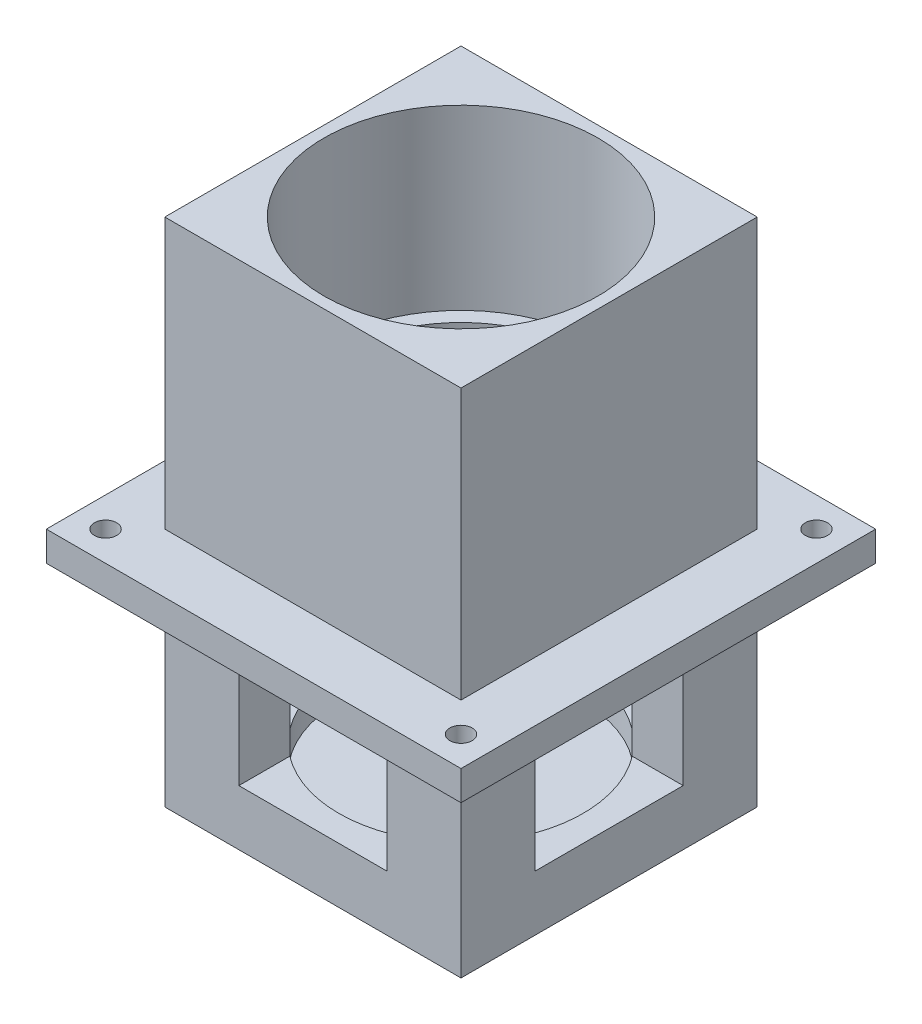
ISO-10303-21;
HEADER;
FILE_DESCRIPTION(('STEP AP214'),'2;1');
FILE_NAME('part.step','',(''),(''),'','','');
FILE_SCHEMA(('AUTOMOTIVE_DESIGN { 1 0 10303 214 1 1 1 1 }'));
ENDSEC;
DATA;
#1=APPLICATION_CONTEXT('core data for automotive mechanical design processes');
#2=APPLICATION_PROTOCOL_DEFINITION('international standard','automotive_design',2000,#1);
#3=PRODUCT_CONTEXT('',#1,'mechanical');
#4=PRODUCT('Part','Part','',(#3));
#5=PRODUCT_RELATED_PRODUCT_CATEGORY('part','',(#4));
#6=PRODUCT_DEFINITION_FORMATION('','',#4);
#7=PRODUCT_DEFINITION_CONTEXT('part definition',#1,'design');
#8=PRODUCT_DEFINITION('design','',#6,#7);
#9=PRODUCT_DEFINITION_SHAPE('','',#8);
#10=(LENGTH_UNIT() NAMED_UNIT(*) SI_UNIT(.MILLI.,.METRE.));
#11=(NAMED_UNIT(*) PLANE_ANGLE_UNIT() SI_UNIT($,.RADIAN.));
#12=(NAMED_UNIT(*) SI_UNIT($,.STERADIAN.) SOLID_ANGLE_UNIT());
#13=UNCERTAINTY_MEASURE_WITH_UNIT(LENGTH_MEASURE(1.E-05),#10,'distance_accuracy_value','');
#14=(GEOMETRIC_REPRESENTATION_CONTEXT(3) GLOBAL_UNCERTAINTY_ASSIGNED_CONTEXT((#13)) GLOBAL_UNIT_ASSIGNED_CONTEXT((#10,
#11,#12)) REPRESENTATION_CONTEXT('',''));
#15=CARTESIAN_POINT('',(0.,0.,0.));
#16=DIRECTION('',(0.,0.,1.));
#17=DIRECTION('',(1.,0.,0.));
#18=AXIS2_PLACEMENT_3D('',#15,#16,#17);
#19=CARTESIAN_POINT('',(-20.,90.,20.));
#20=DIRECTION('',(1.,0.,0.));
#21=DIRECTION('',(0.,0.,-1.));
#22=AXIS2_PLACEMENT_3D('',#19,#20,#21);
#23=PLANE('',#22);
#24=DIRECTION('',(0.,0.,1.));
#25=VECTOR('',#24,1.);
#26=CARTESIAN_POINT('',(-20.,22.5,-10.));
#27=LINE('',#26,#25);
#28=CARTESIAN_POINT('',(-20.,22.5,-10.));
#29=VERTEX_POINT('',#28);
#30=CARTESIAN_POINT('',(-20.,22.5,10.));
#31=VERTEX_POINT('',#30);
#32=EDGE_CURVE('E239',#29,#31,#27,.T.);
#33=ORIENTED_EDGE('',*,*,#32,.T.);
#34=DIRECTION('',(0.,1.,0.));
#35=VECTOR('',#34,1.);
#36=CARTESIAN_POINT('',(-20.,7.5,10.));
#37=LINE('',#36,#35);
#38=CARTESIAN_POINT('',(-20.,7.5,10.));
#39=VERTEX_POINT('',#38);
#40=EDGE_CURVE('E330',#39,#31,#37,.T.);
#41=ORIENTED_EDGE('',*,*,#40,.F.);
#42=DIRECTION('',(0.,0.,1.));
#43=VECTOR('',#42,1.);
#44=CARTESIAN_POINT('',(-20.,7.5,-10.));
#45=LINE('',#44,#43);
#46=CARTESIAN_POINT('',(-20.,7.5,-10.));
#47=VERTEX_POINT('',#46);
#48=EDGE_CURVE('E334',#47,#39,#45,.T.);
#49=ORIENTED_EDGE('',*,*,#48,.F.);
#50=DIRECTION('',(0.,1.,0.));
#51=VECTOR('',#50,1.);
#52=CARTESIAN_POINT('',(-20.,7.5,-10.));
#53=LINE('',#52,#51);
#54=EDGE_CURVE('E315',#47,#29,#53,.T.);
#55=ORIENTED_EDGE('',*,*,#54,.T.);
#56=EDGE_LOOP('',(#33,#41,#49,#55));
#57=FACE_BOUND('',#56,.T.);
#58=DIRECTION('',(0.,0.,1.));
#59=VECTOR('',#58,1.);
#60=CARTESIAN_POINT('',(-20.,28.5,-28.));
#61=LINE('',#60,#59);
#62=CARTESIAN_POINT('',(-20.,28.5,-20.));
#63=VERTEX_POINT('',#62);
#64=CARTESIAN_POINT('',(-20.,28.5,20.));
#65=VERTEX_POINT('',#64);
#66=EDGE_CURVE('E53',#63,#65,#61,.T.);
#67=ORIENTED_EDGE('',*,*,#66,.F.);
#68=DIRECTION('',(0.,-1.,0.));
#69=VECTOR('',#68,1.);
#70=CARTESIAN_POINT('',(-20.,90.,-20.));
#71=LINE('',#70,#69);
#72=CARTESIAN_POINT('',(-20.,0.,-20.));
#73=VERTEX_POINT('',#72);
#74=EDGE_CURVE('E506',#63,#73,#71,.T.);
#75=ORIENTED_EDGE('',*,*,#74,.T.);
#76=DIRECTION('',(0.,0.,1.));
#77=VECTOR('',#76,1.);
#78=CARTESIAN_POINT('',(-20.,0.,20.));
#79=LINE('',#78,#77);
#80=CARTESIAN_POINT('',(-20.,0.,20.));
#81=VERTEX_POINT('',#80);
#82=EDGE_CURVE('E488',#73,#81,#79,.T.);
#83=ORIENTED_EDGE('',*,*,#82,.T.);
#84=DIRECTION('',(0.,-1.,0.));
#85=VECTOR('',#84,1.);
#86=CARTESIAN_POINT('',(-20.,90.,20.));
#87=LINE('',#86,#85);
#88=EDGE_CURVE('E501',#65,#81,#87,.T.);
#89=ORIENTED_EDGE('',*,*,#88,.F.);
#90=EDGE_LOOP('',(#67,#75,#83,#89));
#91=FACE_BOUND('',#90,.T.);
#92=ADVANCED_FACE('F43',(#57,#91),#23,.F.);
#93=CARTESIAN_POINT('',(20.,90.,20.));
#94=DIRECTION('',(-1.,0.,0.));
#95=DIRECTION('',(0.,0.,1.));
#96=AXIS2_PLACEMENT_3D('',#93,#94,#95);
#97=PLANE('',#96);
#98=DIRECTION('',(0.,0.,1.));
#99=VECTOR('',#98,1.);
#100=CARTESIAN_POINT('',(20.,32.5,28.));
#101=LINE('',#100,#99);
#102=CARTESIAN_POINT('',(20.,32.5,-20.));
#103=VERTEX_POINT('',#102);
#104=CARTESIAN_POINT('',(20.,32.5,20.));
#105=VERTEX_POINT('',#104);
#106=EDGE_CURVE('E271',#103,#105,#101,.T.);
#107=ORIENTED_EDGE('',*,*,#106,.F.);
#108=DIRECTION('',(0.,-1.,0.));
#109=VECTOR('',#108,1.);
#110=CARTESIAN_POINT('',(20.,90.,-20.));
#111=LINE('',#110,#109);
#112=CARTESIAN_POINT('',(20.,69.,-20.));
#113=VERTEX_POINT('',#112);
#114=EDGE_CURVE('E288',#113,#103,#111,.T.);
#115=ORIENTED_EDGE('',*,*,#114,.F.);
#116=DIRECTION('',(0.,0.,-1.));
#117=VECTOR('',#116,1.);
#118=CARTESIAN_POINT('',(20.,69.,20.));
#119=LINE('',#118,#117);
#120=CARTESIAN_POINT('',(20.,69.,20.));
#121=VERTEX_POINT('',#120);
#122=EDGE_CURVE('E456',#121,#113,#119,.T.);
#123=ORIENTED_EDGE('',*,*,#122,.F.);
#124=DIRECTION('',(0.,-1.,0.));
#125=VECTOR('',#124,1.);
#126=CARTESIAN_POINT('',(20.,90.,20.));
#127=LINE('',#126,#125);
#128=EDGE_CURVE('E497',#121,#105,#127,.T.);
#129=ORIENTED_EDGE('',*,*,#128,.T.);
#130=EDGE_LOOP('',(#107,#115,#123,#129));
#131=FACE_BOUND('',#130,.T.);
#132=ADVANCED_FACE('F45',(#131),#97,.F.);
#133=DIRECTION('',(0.,0.,1.));
#134=VECTOR('',#133,1.);
#135=CARTESIAN_POINT('',(20.,22.5,-10.));
#136=LINE('',#135,#134);
#137=CARTESIAN_POINT('',(20.,22.5,-10.));
#138=VERTEX_POINT('',#137);
#139=CARTESIAN_POINT('',(20.,22.5,10.));
#140=VERTEX_POINT('',#139);
#141=EDGE_CURVE('E311',#138,#140,#136,.T.);
#142=ORIENTED_EDGE('',*,*,#141,.F.);
#143=DIRECTION('',(0.,1.,0.));
#144=VECTOR('',#143,1.);
#145=CARTESIAN_POINT('',(20.,7.5,-10.));
#146=LINE('',#145,#144);
#147=CARTESIAN_POINT('',(20.,7.50000000000001,-10.));
#148=VERTEX_POINT('',#147);
#149=EDGE_CURVE('E323',#148,#138,#146,.T.);
#150=ORIENTED_EDGE('',*,*,#149,.F.);
#151=DIRECTION('',(0.,0.,1.));
#152=VECTOR('',#151,1.);
#153=CARTESIAN_POINT('',(20.,7.5,-10.));
#154=LINE('',#153,#152);
#155=CARTESIAN_POINT('',(20.,7.5,10.));
#156=VERTEX_POINT('',#155);
#157=EDGE_CURVE('E319',#148,#156,#154,.T.);
#158=ORIENTED_EDGE('',*,*,#157,.T.);
#159=DIRECTION('',(0.,1.,0.));
#160=VECTOR('',#159,1.);
#161=CARTESIAN_POINT('',(20.,7.5,10.));
#162=LINE('',#161,#160);
#163=EDGE_CURVE('E314',#156,#140,#162,.T.);
#164=ORIENTED_EDGE('',*,*,#163,.T.);
#165=EDGE_LOOP('',(#142,#150,#158,#164));
#166=FACE_BOUND('',#165,.T.);
#167=DIRECTION('',(0.,0.,-1.));
#168=VECTOR('',#167,1.);
#169=CARTESIAN_POINT('',(20.,28.5,28.));
#170=LINE('',#169,#168);
#171=CARTESIAN_POINT('',(20.,28.5,20.));
#172=VERTEX_POINT('',#171);
#173=CARTESIAN_POINT('',(20.,28.5,-20.));
#174=VERTEX_POINT('',#173);
#175=EDGE_CURVE('E61',#172,#174,#170,.T.);
#176=ORIENTED_EDGE('',*,*,#175,.F.);
#177=CARTESIAN_POINT('',(20.,0.,20.));
#178=VERTEX_POINT('',#177);
#179=EDGE_CURVE('E496',#172,#178,#127,.T.);
#180=ORIENTED_EDGE('',*,*,#179,.T.);
#181=DIRECTION('',(0.,0.,-1.));
#182=VECTOR('',#181,1.);
#183=CARTESIAN_POINT('',(20.,0.,20.));
#184=LINE('',#183,#182);
#185=CARTESIAN_POINT('',(20.,0.,-20.));
#186=VERTEX_POINT('',#185);
#187=EDGE_CURVE('E480',#178,#186,#184,.T.);
#188=ORIENTED_EDGE('',*,*,#187,.T.);
#189=EDGE_CURVE('E510',#174,#186,#111,.T.);
#190=ORIENTED_EDGE('',*,*,#189,.F.);
#191=EDGE_LOOP('',(#176,#180,#188,#190));
#192=FACE_BOUND('',#191,.T.);
#193=ADVANCED_FACE('F529',(#166,#192),#97,.F.);
#194=CARTESIAN_POINT('',(-20.,90.,-20.));
#195=DIRECTION('',(0.,0.,1.));
#196=DIRECTION('',(1.,0.,0.));
#197=AXIS2_PLACEMENT_3D('',#194,#195,#196);
#198=PLANE('',#197);
#199=DIRECTION('',(1.,0.,0.));
#200=VECTOR('',#199,1.);
#201=CARTESIAN_POINT('',(20.,32.5,-20.));
#202=LINE('',#201,#200);
#203=CARTESIAN_POINT('',(-20.,32.5,-20.));
#204=VERTEX_POINT('',#203);
#205=EDGE_CURVE('E294',#204,#103,#202,.T.);
#206=ORIENTED_EDGE('',*,*,#205,.F.);
#207=CARTESIAN_POINT('',(-20.,69.,-20.));
#208=VERTEX_POINT('',#207);
#209=EDGE_CURVE('E507',#208,#204,#71,.T.);
#210=ORIENTED_EDGE('',*,*,#209,.F.);
#211=DIRECTION('',(-1.,0.,0.));
#212=VECTOR('',#211,1.);
#213=CARTESIAN_POINT('',(-20.,69.,-20.));
#214=LINE('',#213,#212);
#215=EDGE_CURVE('E459',#113,#208,#214,.T.);
#216=ORIENTED_EDGE('',*,*,#215,.F.);
#217=ORIENTED_EDGE('',*,*,#114,.T.);
#218=EDGE_LOOP('',(#206,#210,#216,#217));
#219=FACE_BOUND('',#218,.T.);
#220=ADVANCED_FACE('F615',(#219),#198,.F.);
#221=DIRECTION('',(1.,0.,0.));
#222=VECTOR('',#221,1.);
#223=CARTESIAN_POINT('',(-10.,22.5,-20.));
#224=LINE('',#223,#222);
#225=CARTESIAN_POINT('',(-10.,22.5,-20.));
#226=VERTEX_POINT('',#225);
#227=CARTESIAN_POINT('',(10.,22.5,-20.));
#228=VERTEX_POINT('',#227);
#229=EDGE_CURVE('E383',#226,#228,#224,.T.);
#230=ORIENTED_EDGE('',*,*,#229,.F.);
#231=DIRECTION('',(0.,1.,0.));
#232=VECTOR('',#231,1.);
#233=CARTESIAN_POINT('',(-10.,7.5,-20.));
#234=LINE('',#233,#232);
#235=CARTESIAN_POINT('',(-10.,7.50000000000001,-20.));
#236=VERTEX_POINT('',#235);
#237=EDGE_CURVE('E395',#236,#226,#234,.T.);
#238=ORIENTED_EDGE('',*,*,#237,.F.);
#239=DIRECTION('',(1.,0.,0.));
#240=VECTOR('',#239,1.);
#241=CARTESIAN_POINT('',(-10.,7.5,-20.));
#242=LINE('',#241,#240);
#243=CARTESIAN_POINT('',(10.,7.5,-20.));
#244=VERTEX_POINT('',#243);
#245=EDGE_CURVE('E391',#236,#244,#242,.T.);
#246=ORIENTED_EDGE('',*,*,#245,.T.);
#247=DIRECTION('',(0.,1.,0.));
#248=VECTOR('',#247,1.);
#249=CARTESIAN_POINT('',(10.,7.5,-20.));
#250=LINE('',#249,#248);
#251=EDGE_CURVE('E386',#244,#228,#250,.T.);
#252=ORIENTED_EDGE('',*,*,#251,.T.);
#253=EDGE_LOOP('',(#230,#238,#246,#252));
#254=FACE_BOUND('',#253,.T.);
#255=DIRECTION('',(-1.,0.,0.));
#256=VECTOR('',#255,1.);
#257=CARTESIAN_POINT('',(20.,28.5,-20.));
#258=LINE('',#257,#256);
#259=EDGE_CURVE('E285',#174,#63,#258,.T.);
#260=ORIENTED_EDGE('',*,*,#259,.F.);
#261=ORIENTED_EDGE('',*,*,#189,.T.);
#262=DIRECTION('',(-1.,0.,0.));
#263=VECTOR('',#262,1.);
#264=CARTESIAN_POINT('',(-20.,0.,-20.));
#265=LINE('',#264,#263);
#266=EDGE_CURVE('E484',#186,#73,#265,.T.);
#267=ORIENTED_EDGE('',*,*,#266,.T.);
#268=ORIENTED_EDGE('',*,*,#74,.F.);
#269=EDGE_LOOP('',(#260,#261,#267,#268));
#270=FACE_BOUND('',#269,.T.);
#271=ADVANCED_FACE('F521',(#254,#270),#198,.F.);
#272=CARTESIAN_POINT('',(-20.,90.,20.));
#273=DIRECTION('',(0.,0.,-1.));
#274=DIRECTION('',(-1.,0.,0.));
#275=AXIS2_PLACEMENT_3D('',#272,#273,#274);
#276=PLANE('',#275);
#277=DIRECTION('',(-1.,0.,0.));
#278=VECTOR('',#277,1.);
#279=CARTESIAN_POINT('',(-20.0000000000002,32.5,20.));
#280=LINE('',#279,#278);
#281=CARTESIAN_POINT('',(-20.,32.5,20.));
#282=VERTEX_POINT('',#281);
#283=EDGE_CURVE('E304',#105,#282,#280,.T.);
#284=ORIENTED_EDGE('',*,*,#283,.F.);
#285=ORIENTED_EDGE('',*,*,#128,.F.);
#286=DIRECTION('',(1.,0.,0.));
#287=VECTOR('',#286,1.);
#288=CARTESIAN_POINT('',(-20.,69.,20.));
#289=LINE('',#288,#287);
#290=CARTESIAN_POINT('',(-20.,69.,20.));
#291=VERTEX_POINT('',#290);
#292=EDGE_CURVE('E465',#291,#121,#289,.T.);
#293=ORIENTED_EDGE('',*,*,#292,.F.);
#294=EDGE_CURVE('E502',#291,#282,#87,.T.);
#295=ORIENTED_EDGE('',*,*,#294,.T.);
#296=EDGE_LOOP('',(#284,#285,#293,#295));
#297=FACE_BOUND('',#296,.T.);
#298=ADVANCED_FACE('F620',(#297),#276,.F.);
#299=DIRECTION('',(1.,0.,0.));
#300=VECTOR('',#299,1.);
#301=CARTESIAN_POINT('',(-10.,22.5,20.));
#302=LINE('',#301,#300);
#303=CARTESIAN_POINT('',(-10.,22.5,20.));
#304=VERTEX_POINT('',#303);
#305=CARTESIAN_POINT('',(10.,22.5,20.));
#306=VERTEX_POINT('',#305);
#307=EDGE_CURVE('E399',#304,#306,#302,.T.);
#308=ORIENTED_EDGE('',*,*,#307,.T.);
#309=DIRECTION('',(0.,1.,0.));
#310=VECTOR('',#309,1.);
#311=CARTESIAN_POINT('',(10.,7.5,20.));
#312=LINE('',#311,#310);
#313=CARTESIAN_POINT('',(10.,7.5,20.));
#314=VERTEX_POINT('',#313);
#315=EDGE_CURVE('E403',#314,#306,#312,.T.);
#316=ORIENTED_EDGE('',*,*,#315,.F.);
#317=DIRECTION('',(1.,0.,0.));
#318=VECTOR('',#317,1.);
#319=CARTESIAN_POINT('',(-10.,7.5,20.));
#320=LINE('',#319,#318);
#321=CARTESIAN_POINT('',(-10.,7.5,20.));
#322=VERTEX_POINT('',#321);
#323=EDGE_CURVE('E407',#322,#314,#320,.T.);
#324=ORIENTED_EDGE('',*,*,#323,.F.);
#325=DIRECTION('',(0.,1.,0.));
#326=VECTOR('',#325,1.);
#327=CARTESIAN_POINT('',(-10.,7.5,20.));
#328=LINE('',#327,#326);
#329=EDGE_CURVE('E387',#322,#304,#328,.T.);
#330=ORIENTED_EDGE('',*,*,#329,.T.);
#331=EDGE_LOOP('',(#308,#316,#324,#330));
#332=FACE_BOUND('',#331,.T.);
#333=DIRECTION('',(1.,0.,0.));
#334=VECTOR('',#333,1.);
#335=CARTESIAN_POINT('',(-20.0000000000002,28.5,20.));
#336=LINE('',#335,#334);
#337=EDGE_CURVE('E297',#65,#172,#336,.T.);
#338=ORIENTED_EDGE('',*,*,#337,.F.);
#339=ORIENTED_EDGE('',*,*,#88,.T.);
#340=DIRECTION('',(1.,0.,0.));
#341=VECTOR('',#340,1.);
#342=CARTESIAN_POINT('',(-20.,0.,20.));
#343=LINE('',#342,#341);
#344=EDGE_CURVE('E492',#81,#178,#343,.T.);
#345=ORIENTED_EDGE('',*,*,#344,.T.);
#346=ORIENTED_EDGE('',*,*,#179,.F.);
#347=EDGE_LOOP('',(#338,#339,#345,#346));
#348=FACE_BOUND('',#347,.T.);
#349=ADVANCED_FACE('F533',(#332,#348),#276,.F.);
#350=CARTESIAN_POINT('',(0.,4.,0.));
#351=DIRECTION('',(0.,1.,0.));
#352=DIRECTION('',(0.,0.,1.));
#353=AXIS2_PLACEMENT_3D('',#350,#351,#352);
#354=CYLINDRICAL_SURFACE('',#353,16.5);
#355=CARTESIAN_POINT('',(0.,22.5,0.));
#356=DIRECTION('',(0.,-1.,0.));
#357=DIRECTION('',(0.,0.,-1.));
#358=AXIS2_PLACEMENT_3D('',#355,#356,#357);
#359=CIRCLE('',#358,16.5);
#360=CARTESIAN_POINT('',(-13.1244047484067,22.5,-10.));
#361=VERTEX_POINT('',#360);
#362=CARTESIAN_POINT('',(-13.1244047484067,22.5,10.));
#363=VERTEX_POINT('',#362);
#364=EDGE_CURVE('E382',#361,#363,#359,.F.);
#365=ORIENTED_EDGE('',*,*,#364,.F.);
#366=DIRECTION('',(0.,1.,0.));
#367=VECTOR('',#366,1.);
#368=CARTESIAN_POINT('',(-13.1244047484067,4.,-10.));
#369=LINE('',#368,#367);
#370=CARTESIAN_POINT('',(-13.1244047484067,7.5,-10.));
#371=VERTEX_POINT('',#370);
#372=EDGE_CURVE('E359',#371,#361,#369,.T.);
#373=ORIENTED_EDGE('',*,*,#372,.F.);
#374=CARTESIAN_POINT('',(0.,7.5,0.));
#375=DIRECTION('',(0.,-1.,0.));
#376=DIRECTION('',(0.,0.,-1.));
#377=AXIS2_PLACEMENT_3D('',#374,#375,#376);
#378=CIRCLE('',#377,16.5);
#379=CARTESIAN_POINT('',(-13.1244047484067,7.5,10.));
#380=VERTEX_POINT('',#379);
#381=EDGE_CURVE('E369',#371,#380,#378,.F.);
#382=ORIENTED_EDGE('',*,*,#381,.T.);
#383=DIRECTION('',(0.,1.,0.));
#384=VECTOR('',#383,1.);
#385=CARTESIAN_POINT('',(-13.1244047484067,4.,10.));
#386=LINE('',#385,#384);
#387=EDGE_CURVE('E370',#380,#363,#386,.T.);
#388=ORIENTED_EDGE('',*,*,#387,.T.);
#389=EDGE_LOOP('',(#365,#373,#382,#388));
#390=FACE_BOUND('',#389,.T.);
#391=CARTESIAN_POINT('',(0.,22.5,0.));
#392=DIRECTION('',(0.,-1.,0.));
#393=DIRECTION('',(0.,0.,-1.));
#394=AXIS2_PLACEMENT_3D('',#391,#392,#393);
#395=CIRCLE('',#394,16.5);
#396=CARTESIAN_POINT('',(-10.,22.5,13.1244047484067));
#397=VERTEX_POINT('',#396);
#398=CARTESIAN_POINT('',(10.,22.5,13.1244047484067));
#399=VERTEX_POINT('',#398);
#400=EDGE_CURVE('E455',#397,#399,#395,.F.);
#401=ORIENTED_EDGE('',*,*,#400,.F.);
#402=DIRECTION('',(0.,1.,0.));
#403=VECTOR('',#402,1.);
#404=CARTESIAN_POINT('',(-10.,4.,13.1244047484067));
#405=LINE('',#404,#403);
#406=CARTESIAN_POINT('',(-10.,7.5,13.1244047484067));
#407=VERTEX_POINT('',#406);
#408=EDGE_CURVE('E432',#407,#397,#405,.T.);
#409=ORIENTED_EDGE('',*,*,#408,.F.);
#410=CARTESIAN_POINT('',(0.,7.5,0.));
#411=DIRECTION('',(0.,-1.,0.));
#412=DIRECTION('',(1.,0.,0.));
#413=AXIS2_PLACEMENT_3D('',#410,#411,#412);
#414=CIRCLE('',#413,16.5);
#415=CARTESIAN_POINT('',(10.,7.5,13.1244047484067));
#416=VERTEX_POINT('',#415);
#417=EDGE_CURVE('E438',#407,#416,#414,.F.);
#418=ORIENTED_EDGE('',*,*,#417,.T.);
#419=DIRECTION('',(0.,1.,0.));
#420=VECTOR('',#419,1.);
#421=CARTESIAN_POINT('',(10.,4.,13.1244047484067));
#422=LINE('',#421,#420);
#423=EDGE_CURVE('E443',#416,#399,#422,.T.);
#424=ORIENTED_EDGE('',*,*,#423,.T.);
#425=EDGE_LOOP('',(#401,#409,#418,#424));
#426=FACE_BOUND('',#425,.T.);
#427=CARTESIAN_POINT('',(0.,4.,0.));
#428=DIRECTION('',(0.,1.,0.));
#429=DIRECTION('',(0.,0.,1.));
#430=AXIS2_PLACEMENT_3D('',#427,#428,#429);
#431=CIRCLE('',#430,16.5);
#432=CARTESIAN_POINT('',(0.,4.,16.5));
#433=VERTEX_POINT('',#432);
#434=EDGE_CURVE('E468',#433,#433,#431,.T.);
#435=ORIENTED_EDGE('',*,*,#434,.F.);
#436=EDGE_LOOP('',(#435));
#437=FACE_BOUND('',#436,.T.);
#438=CARTESIAN_POINT('',(0.,45.,0.));
#439=DIRECTION('',(0.,1.,0.));
#440=DIRECTION('',(0.,0.,1.));
#441=AXIS2_PLACEMENT_3D('',#438,#439,#440);
#442=CIRCLE('',#441,16.5);
#443=CARTESIAN_POINT('',(0.,45.,16.5));
#444=VERTEX_POINT('',#443);
#445=EDGE_CURVE('E473',#444,#444,#442,.T.);
#446=ORIENTED_EDGE('',*,*,#445,.T.);
#447=EDGE_LOOP('',(#446));
#448=FACE_BOUND('',#447,.T.);
#449=CARTESIAN_POINT('',(10.,22.5,-13.1244047484067));
#450=VERTEX_POINT('',#449);
#451=CARTESIAN_POINT('',(-10.,22.5,-13.1244047484067));
#452=VERTEX_POINT('',#451);
#453=EDGE_CURVE('E451',#450,#452,#395,.F.);
#454=ORIENTED_EDGE('',*,*,#453,.F.);
#455=DIRECTION('',(0.,1.,0.));
#456=VECTOR('',#455,1.);
#457=CARTESIAN_POINT('',(10.,4.,-13.1244047484067));
#458=LINE('',#457,#456);
#459=CARTESIAN_POINT('',(10.,7.5,-13.1244047484067));
#460=VERTEX_POINT('',#459);
#461=EDGE_CURVE('E447',#450,#460,#458,.F.);
#462=ORIENTED_EDGE('',*,*,#461,.T.);
#463=CARTESIAN_POINT('',(-10.,7.5,-13.1244047484067));
#464=VERTEX_POINT('',#463);
#465=EDGE_CURVE('E442',#460,#464,#414,.F.);
#466=ORIENTED_EDGE('',*,*,#465,.T.);
#467=DIRECTION('',(0.,1.,0.));
#468=VECTOR('',#467,1.);
#469=CARTESIAN_POINT('',(-10.,4.,-13.1244047484067));
#470=LINE('',#469,#468);
#471=EDGE_CURVE('E435',#452,#464,#470,.F.);
#472=ORIENTED_EDGE('',*,*,#471,.F.);
#473=EDGE_LOOP('',(#454,#462,#466,#472));
#474=FACE_BOUND('',#473,.T.);
#475=CARTESIAN_POINT('',(13.1244047484067,22.5,10.));
#476=VERTEX_POINT('',#475);
#477=CARTESIAN_POINT('',(13.1244047484067,22.5,-10.));
#478=VERTEX_POINT('',#477);
#479=EDGE_CURVE('E378',#476,#478,#359,.F.);
#480=ORIENTED_EDGE('',*,*,#479,.F.);
#481=DIRECTION('',(0.,1.,0.));
#482=VECTOR('',#481,1.);
#483=CARTESIAN_POINT('',(13.1244047484067,4.,10.));
#484=LINE('',#483,#482);
#485=CARTESIAN_POINT('',(13.1244047484067,7.5,10.));
#486=VERTEX_POINT('',#485);
#487=EDGE_CURVE('E374',#476,#486,#484,.F.);
#488=ORIENTED_EDGE('',*,*,#487,.T.);
#489=CARTESIAN_POINT('',(13.1244047484067,7.5,-10.));
#490=VERTEX_POINT('',#489);
#491=EDGE_CURVE('E365',#486,#490,#378,.F.);
#492=ORIENTED_EDGE('',*,*,#491,.T.);
#493=DIRECTION('',(0.,1.,0.));
#494=VECTOR('',#493,1.);
#495=CARTESIAN_POINT('',(13.1244047484067,4.,-10.));
#496=LINE('',#495,#494);
#497=EDGE_CURVE('E362',#478,#490,#496,.F.);
#498=ORIENTED_EDGE('',*,*,#497,.F.);
#499=EDGE_LOOP('',(#480,#488,#492,#498));
#500=FACE_BOUND('',#499,.T.);
#501=ADVANCED_FACE('F571',(#390,#426,#437,#448,#474,#500),#354,.F.);
#502=ORIENTED_EDGE('',*,*,#209,.T.);
#503=DIRECTION('',(0.,0.,1.));
#504=VECTOR('',#503,1.);
#505=CARTESIAN_POINT('',(-20.,32.5,-28.));
#506=LINE('',#505,#504);
#507=EDGE_CURVE('E11',#204,#282,#506,.T.);
#508=ORIENTED_EDGE('',*,*,#507,.T.);
#509=ORIENTED_EDGE('',*,*,#294,.F.);
#510=DIRECTION('',(0.,0.,1.));
#511=VECTOR('',#510,1.);
#512=CARTESIAN_POINT('',(-20.,69.,20.));
#513=LINE('',#512,#511);
#514=EDGE_CURVE('E462',#208,#291,#513,.T.);
#515=ORIENTED_EDGE('',*,*,#514,.F.);
#516=EDGE_LOOP('',(#502,#508,#509,#515));
#517=FACE_BOUND('',#516,.T.);
#518=ADVANCED_FACE('F592',(#517),#23,.F.);
#519=CARTESIAN_POINT('',(0.,45.,0.));
#520=DIRECTION('',(0.,1.,0.));
#521=DIRECTION('',(0.,0.,1.));
#522=AXIS2_PLACEMENT_3D('',#519,#520,#521);
#523=CYLINDRICAL_SURFACE('',#522,18.5);
#524=CARTESIAN_POINT('',(0.,69.,0.));
#525=DIRECTION('',(0.,-1.,0.));
#526=DIRECTION('',(0.,0.,-1.));
#527=AXIS2_PLACEMENT_3D('',#524,#525,#526);
#528=CIRCLE('',#527,18.5);
#529=CARTESIAN_POINT('',(0.,69.,18.5));
#530=VERTEX_POINT('',#529);
#531=EDGE_CURVE('E47',#530,#530,#528,.F.);
#532=CARTESIAN_POINT('',(0.,45.,0.));
#533=DIRECTION('',(0.,1.,0.));
#534=DIRECTION('',(0.,0.,1.));
#535=AXIS2_PLACEMENT_3D('',#532,#533,#534);
#536=CIRCLE('',#535,18.5);
#537=CARTESIAN_POINT('',(0.,45.,18.5));
#538=VERTEX_POINT('',#537);
#539=EDGE_CURVE('E472',#538,#538,#536,.T.);
#540=CARTESIAN_POINT('',(0.,69.,18.5));
#541=CARTESIAN_POINT('',(0.,68.75,18.5));
#542=CARTESIAN_POINT('',(0.,68.5,18.5));
#543=CARTESIAN_POINT('',(0.,68.,18.5));
#544=CARTESIAN_POINT('',(0.,67.75,18.5));
#545=CARTESIAN_POINT('',(0.,67.25,18.5));
#546=CARTESIAN_POINT('',(0.,67.,18.5));
#547=CARTESIAN_POINT('',(0.,66.5,18.5));
#548=CARTESIAN_POINT('',(0.,66.25,18.5));
#549=CARTESIAN_POINT('',(0.,65.75,18.5));
#550=CARTESIAN_POINT('',(0.,65.5,18.5));
#551=CARTESIAN_POINT('',(0.,65.,18.5));
#552=CARTESIAN_POINT('',(0.,64.75,18.5));
#553=CARTESIAN_POINT('',(0.,64.25,18.5));
#554=CARTESIAN_POINT('',(0.,64.,18.5));
#555=CARTESIAN_POINT('',(0.,63.5,18.5));
#556=CARTESIAN_POINT('',(0.,63.25,18.5));
#557=CARTESIAN_POINT('',(0.,62.75,18.5));
#558=CARTESIAN_POINT('',(0.,62.5,18.5));
#559=CARTESIAN_POINT('',(0.,62.,18.5));
#560=CARTESIAN_POINT('',(0.,61.75,18.5));
#561=CARTESIAN_POINT('',(0.,61.25,18.5));
#562=CARTESIAN_POINT('',(0.,61.,18.5));
#563=CARTESIAN_POINT('',(0.,60.5,18.5));
#564=CARTESIAN_POINT('',(0.,60.25,18.5));
#565=CARTESIAN_POINT('',(0.,59.75,18.5));
#566=CARTESIAN_POINT('',(0.,59.5,18.5));
#567=CARTESIAN_POINT('',(0.,59.,18.5));
#568=CARTESIAN_POINT('',(0.,58.75,18.5));
#569=CARTESIAN_POINT('',(0.,58.25,18.5));
#570=CARTESIAN_POINT('',(0.,58.,18.5));
#571=CARTESIAN_POINT('',(0.,57.5,18.5));
#572=CARTESIAN_POINT('',(0.,57.25,18.5));
#573=CARTESIAN_POINT('',(0.,56.75,18.5));
#574=CARTESIAN_POINT('',(0.,56.5,18.5));
#575=CARTESIAN_POINT('',(0.,56.,18.5));
#576=CARTESIAN_POINT('',(0.,55.75,18.5));
#577=CARTESIAN_POINT('',(0.,55.25,18.5));
#578=CARTESIAN_POINT('',(0.,55.,18.5));
#579=CARTESIAN_POINT('',(0.,54.5,18.5));
#580=CARTESIAN_POINT('',(0.,54.25,18.5));
#581=CARTESIAN_POINT('',(0.,53.75,18.5));
#582=CARTESIAN_POINT('',(0.,53.5,18.5));
#583=CARTESIAN_POINT('',(0.,53.,18.5));
#584=CARTESIAN_POINT('',(0.,52.75,18.5));
#585=CARTESIAN_POINT('',(0.,52.25,18.5));
#586=CARTESIAN_POINT('',(0.,52.,18.5));
#587=CARTESIAN_POINT('',(0.,51.5,18.5));
#588=CARTESIAN_POINT('',(0.,51.25,18.5));
#589=CARTESIAN_POINT('',(0.,50.75,18.5));
#590=CARTESIAN_POINT('',(0.,50.5,18.5));
#591=CARTESIAN_POINT('',(0.,50.,18.5));
#592=CARTESIAN_POINT('',(0.,49.75,18.5));
#593=CARTESIAN_POINT('',(0.,49.25,18.5));
#594=CARTESIAN_POINT('',(0.,49.,18.5));
#595=CARTESIAN_POINT('',(0.,48.5,18.5));
#596=CARTESIAN_POINT('',(0.,48.25,18.5));
#597=CARTESIAN_POINT('',(0.,47.75,18.5));
#598=CARTESIAN_POINT('',(0.,47.5,18.5));
#599=CARTESIAN_POINT('',(0.,47.,18.5));
#600=CARTESIAN_POINT('',(0.,46.75,18.5));
#601=CARTESIAN_POINT('',(0.,46.25,18.5));
#602=CARTESIAN_POINT('',(0.,46.,18.5));
#603=CARTESIAN_POINT('',(0.,45.5,18.5));
#604=CARTESIAN_POINT('',(0.,45.25,18.5));
#605=CARTESIAN_POINT('',(0.,45.,18.5));
#606=B_SPLINE_CURVE_WITH_KNOTS('',3,(#540,#541,#542,#543,#544,#545,#546,#547,#548,#549,#550,
#551,#552,#553,#554,#555,#556,#557,#558,#559,#560,#561,#562,#563,#564,#565,#566,#567,#568,#569,
#570,#571,#572,#573,#574,#575,#576,#577,#578,#579,#580,#581,#582,#583,#584,#585,#586,#587,#588,
#589,#590,#591,#592,#593,#594,#595,#596,#597,#598,#599,#600,#601,#602,#603,#604,#605),
.UNSPECIFIED.,.F.,.F.,(4,2,2,2,2,2,2,2,2,2,2,2,2,2,2,2,2,2,2,2,2,2,2,2,2,2,2,2,2,2,2,2,4),(0.,
0.750000000000001,1.5,2.25,2.99999999999999,3.74999999999999,4.49999999999999,5.24999999999999,
5.99999999999999,6.74999999999999,7.49999999999999,8.24999999999999,8.99999999999999,
9.74999999999999,10.5,11.25,12.,12.75,13.5,14.25,15.,15.75,16.5,17.25,18.,18.75,19.5,20.25,21.,
21.75,22.5,23.25,24.),.UNSPECIFIED.);
#607=EDGE_CURVE('BSEAM600',#530,#538,#606,.T.);
#608=ORIENTED_EDGE('',*,*,#531,.T.);
#609=ORIENTED_EDGE('',*,*,#539,.F.);
#610=ORIENTED_EDGE('',*,*,#607,.T.);
#611=ORIENTED_EDGE('',*,*,#607,.F.);
#612=EDGE_LOOP('',(#608,#610,#609,#611));
#613=FACE_BOUND('',#612,.T.);
#614=ADVANCED_FACE('F600',(#613),#523,.F.);
#615=CARTESIAN_POINT('',(0.,45.,0.));
#616=DIRECTION('',(0.,1.,0.));
#617=DIRECTION('',(0.,0.,1.));
#618=AXIS2_PLACEMENT_3D('',#615,#616,#617);
#619=PLANE('',#618);
#620=ORIENTED_EDGE('',*,*,#445,.F.);
#621=EDGE_LOOP('',(#620));
#622=FACE_BOUND('',#621,.T.);
#623=ORIENTED_EDGE('',*,*,#539,.T.);
#624=EDGE_LOOP('',(#623));
#625=FACE_BOUND('',#624,.T.);
#626=ADVANCED_FACE('F607',(#622,#625),#619,.T.);
#627=CARTESIAN_POINT('',(0.,4.,0.));
#628=DIRECTION('',(0.,1.,0.));
#629=DIRECTION('',(0.,0.,1.));
#630=AXIS2_PLACEMENT_3D('',#627,#628,#629);
#631=PLANE('',#630);
#632=ORIENTED_EDGE('',*,*,#434,.T.);
#633=EDGE_LOOP('',(#632));
#634=FACE_BOUND('',#633,.T.);
#635=ADVANCED_FACE('F627',(#634),#631,.T.);
#636=CARTESIAN_POINT('',(0.,69.,0.));
#637=DIRECTION('',(0.,-1.,0.));
#638=DIRECTION('',(0.,0.,-1.));
#639=AXIS2_PLACEMENT_3D('',#636,#637,#638);
#640=PLANE('',#639);
#641=ORIENTED_EDGE('',*,*,#122,.T.);
#642=ORIENTED_EDGE('',*,*,#215,.T.);
#643=ORIENTED_EDGE('',*,*,#514,.T.);
#644=ORIENTED_EDGE('',*,*,#292,.T.);
#645=EDGE_LOOP('',(#641,#642,#643,#644));
#646=FACE_BOUND('',#645,.T.);
#647=ORIENTED_EDGE('',*,*,#531,.F.);
#648=EDGE_LOOP('',(#647));
#649=FACE_BOUND('',#648,.T.);
#650=ADVANCED_FACE('F624',(#646,#649),#640,.F.);
#651=CARTESIAN_POINT('',(0.,0.,0.));
#652=DIRECTION('',(0.,-1.,0.));
#653=DIRECTION('',(0.,0.,-1.));
#654=AXIS2_PLACEMENT_3D('',#651,#652,#653);
#655=PLANE('',#654);
#656=ORIENTED_EDGE('',*,*,#187,.F.);
#657=ORIENTED_EDGE('',*,*,#344,.F.);
#658=ORIENTED_EDGE('',*,*,#82,.F.);
#659=ORIENTED_EDGE('',*,*,#266,.F.);
#660=EDGE_LOOP('',(#656,#657,#658,#659));
#661=FACE_BOUND('',#660,.T.);
#662=ADVANCED_FACE('F527',(#661),#655,.T.);
#663=CARTESIAN_POINT('',(-10.,7.5,-20.));
#664=DIRECTION('',(1.,0.,0.));
#665=DIRECTION('',(0.,0.,-1.));
#666=AXIS2_PLACEMENT_3D('',#663,#664,#665);
#667=PLANE('',#666);
#668=ORIENTED_EDGE('',*,*,#471,.T.);
#669=DIRECTION('',(0.,0.,1.));
#670=VECTOR('',#669,1.);
#671=CARTESIAN_POINT('',(-10.,7.5,-20.));
#672=LINE('',#671,#670);
#673=EDGE_CURVE('E418',#236,#464,#672,.T.);
#674=ORIENTED_EDGE('',*,*,#673,.F.);
#675=ORIENTED_EDGE('',*,*,#237,.T.);
#676=DIRECTION('',(0.,0.,1.));
#677=VECTOR('',#676,1.);
#678=CARTESIAN_POINT('',(-10.,22.5,-20.));
#679=LINE('',#678,#677);
#680=EDGE_CURVE('E414',#226,#452,#679,.T.);
#681=ORIENTED_EDGE('',*,*,#680,.T.);
#682=EDGE_LOOP('',(#668,#674,#675,#681));
#683=FACE_BOUND('',#682,.T.);
#684=ADVANCED_FACE('F644',(#683),#667,.T.);
#685=CARTESIAN_POINT('',(-10.,7.5,-20.));
#686=DIRECTION('',(0.,-1.,0.));
#687=DIRECTION('',(1.,0.,0.));
#688=AXIS2_PLACEMENT_3D('',#685,#686,#687);
#689=PLANE('',#688);
#690=DIRECTION('',(0.,0.,1.));
#691=VECTOR('',#690,1.);
#692=CARTESIAN_POINT('',(10.,7.5,-20.));
#693=LINE('',#692,#691);
#694=EDGE_CURVE('E423',#244,#460,#693,.T.);
#695=ORIENTED_EDGE('',*,*,#694,.F.);
#696=ORIENTED_EDGE('',*,*,#245,.F.);
#697=ORIENTED_EDGE('',*,*,#673,.T.);
#698=ORIENTED_EDGE('',*,*,#465,.F.);
#699=EDGE_LOOP('',(#695,#696,#697,#698));
#700=FACE_BOUND('',#699,.T.);
#701=ADVANCED_FACE('F671',(#700),#689,.F.);
#702=CARTESIAN_POINT('',(10.,7.5,-20.));
#703=DIRECTION('',(1.,0.,0.));
#704=DIRECTION('',(0.,0.,-1.));
#705=AXIS2_PLACEMENT_3D('',#702,#703,#704);
#706=PLANE('',#705);
#707=DIRECTION('',(0.,0.,1.));
#708=VECTOR('',#707,1.);
#709=CARTESIAN_POINT('',(10.,22.5,-20.));
#710=LINE('',#709,#708);
#711=EDGE_CURVE('E428',#228,#450,#710,.T.);
#712=ORIENTED_EDGE('',*,*,#711,.F.);
#713=ORIENTED_EDGE('',*,*,#251,.F.);
#714=ORIENTED_EDGE('',*,*,#694,.T.);
#715=ORIENTED_EDGE('',*,*,#461,.F.);
#716=EDGE_LOOP('',(#712,#713,#714,#715));
#717=FACE_BOUND('',#716,.T.);
#718=ADVANCED_FACE('F664',(#717),#706,.F.);
#719=CARTESIAN_POINT('',(-10.,22.5,-20.));
#720=DIRECTION('',(0.,-1.,0.));
#721=DIRECTION('',(0.,0.,-1.));
#722=AXIS2_PLACEMENT_3D('',#719,#720,#721);
#723=PLANE('',#722);
#724=ORIENTED_EDGE('',*,*,#453,.T.);
#725=ORIENTED_EDGE('',*,*,#680,.F.);
#726=ORIENTED_EDGE('',*,*,#229,.T.);
#727=ORIENTED_EDGE('',*,*,#711,.T.);
#728=EDGE_LOOP('',(#724,#725,#726,#727));
#729=FACE_BOUND('',#728,.T.);
#730=ADVANCED_FACE('F661',(#729),#723,.T.);
#731=ORIENTED_EDGE('',*,*,#400,.T.);
#732=EDGE_CURVE('E427',#399,#306,#710,.T.);
#733=ORIENTED_EDGE('',*,*,#732,.T.);
#734=ORIENTED_EDGE('',*,*,#307,.F.);
#735=EDGE_CURVE('E398',#397,#304,#679,.T.);
#736=ORIENTED_EDGE('',*,*,#735,.F.);
#737=EDGE_LOOP('',(#731,#733,#734,#736));
#738=FACE_BOUND('',#737,.T.);
#739=ADVANCED_FACE('F691',(#738),#723,.T.);
#740=EDGE_CURVE('E422',#416,#314,#693,.T.);
#741=ORIENTED_EDGE('',*,*,#740,.T.);
#742=ORIENTED_EDGE('',*,*,#315,.T.);
#743=ORIENTED_EDGE('',*,*,#732,.F.);
#744=ORIENTED_EDGE('',*,*,#423,.F.);
#745=EDGE_LOOP('',(#741,#742,#743,#744));
#746=FACE_BOUND('',#745,.T.);
#747=ADVANCED_FACE('F680',(#746),#706,.F.);
#748=EDGE_CURVE('E417',#407,#322,#672,.T.);
#749=ORIENTED_EDGE('',*,*,#748,.T.);
#750=ORIENTED_EDGE('',*,*,#323,.T.);
#751=ORIENTED_EDGE('',*,*,#740,.F.);
#752=ORIENTED_EDGE('',*,*,#417,.F.);
#753=EDGE_LOOP('',(#749,#750,#751,#752));
#754=FACE_BOUND('',#753,.T.);
#755=ADVANCED_FACE('F674',(#754),#689,.F.);
#756=ORIENTED_EDGE('',*,*,#408,.T.);
#757=ORIENTED_EDGE('',*,*,#735,.T.);
#758=ORIENTED_EDGE('',*,*,#329,.F.);
#759=ORIENTED_EDGE('',*,*,#748,.F.);
#760=EDGE_LOOP('',(#756,#757,#758,#759));
#761=FACE_BOUND('',#760,.T.);
#762=ADVANCED_FACE('F682',(#761),#667,.T.);
#763=CARTESIAN_POINT('',(20.,7.5,-10.));
#764=DIRECTION('',(0.,0.,1.));
#765=DIRECTION('',(1.,0.,0.));
#766=AXIS2_PLACEMENT_3D('',#763,#764,#765);
#767=PLANE('',#766);
#768=ORIENTED_EDGE('',*,*,#497,.T.);
#769=DIRECTION('',(-1.,0.,0.));
#770=VECTOR('',#769,1.);
#771=CARTESIAN_POINT('',(20.,7.5,-10.));
#772=LINE('',#771,#770);
#773=EDGE_CURVE('E345',#148,#490,#772,.T.);
#774=ORIENTED_EDGE('',*,*,#773,.F.);
#775=ORIENTED_EDGE('',*,*,#149,.T.);
#776=DIRECTION('',(-1.,0.,0.));
#777=VECTOR('',#776,1.);
#778=CARTESIAN_POINT('',(20.,22.5,-10.));
#779=LINE('',#778,#777);
#780=EDGE_CURVE('E341',#138,#478,#779,.T.);
#781=ORIENTED_EDGE('',*,*,#780,.T.);
#782=EDGE_LOOP('',(#768,#774,#775,#781));
#783=FACE_BOUND('',#782,.T.);
#784=ADVANCED_FACE('F689',(#783),#767,.T.);
#785=CARTESIAN_POINT('',(20.,7.5,-10.));
#786=DIRECTION('',(0.,-1.,0.));
#787=DIRECTION('',(0.,0.,-1.));
#788=AXIS2_PLACEMENT_3D('',#785,#786,#787);
#789=PLANE('',#788);
#790=DIRECTION('',(-1.,0.,0.));
#791=VECTOR('',#790,1.);
#792=CARTESIAN_POINT('',(20.,7.5,10.));
#793=LINE('',#792,#791);
#794=EDGE_CURVE('E350',#156,#486,#793,.T.);
#795=ORIENTED_EDGE('',*,*,#794,.F.);
#796=ORIENTED_EDGE('',*,*,#157,.F.);
#797=ORIENTED_EDGE('',*,*,#773,.T.);
#798=ORIENTED_EDGE('',*,*,#491,.F.);
#799=EDGE_LOOP('',(#795,#796,#797,#798));
#800=FACE_BOUND('',#799,.T.);
#801=ADVANCED_FACE('F585',(#800),#789,.F.);
#802=CARTESIAN_POINT('',(20.,7.5,10.));
#803=DIRECTION('',(0.,0.,1.));
#804=DIRECTION('',(1.,0.,0.));
#805=AXIS2_PLACEMENT_3D('',#802,#803,#804);
#806=PLANE('',#805);
#807=DIRECTION('',(-1.,0.,0.));
#808=VECTOR('',#807,1.);
#809=CARTESIAN_POINT('',(20.,22.5,10.));
#810=LINE('',#809,#808);
#811=EDGE_CURVE('E355',#140,#476,#810,.T.);
#812=ORIENTED_EDGE('',*,*,#811,.F.);
#813=ORIENTED_EDGE('',*,*,#163,.F.);
#814=ORIENTED_EDGE('',*,*,#794,.T.);
#815=ORIENTED_EDGE('',*,*,#487,.F.);
#816=EDGE_LOOP('',(#812,#813,#814,#815));
#817=FACE_BOUND('',#816,.T.);
#818=ADVANCED_FACE('F579',(#817),#806,.F.);
#819=CARTESIAN_POINT('',(20.,22.5,-10.));
#820=DIRECTION('',(0.,-1.,0.));
#821=DIRECTION('',(0.,0.,-1.));
#822=AXIS2_PLACEMENT_3D('',#819,#820,#821);
#823=PLANE('',#822);
#824=ORIENTED_EDGE('',*,*,#479,.T.);
#825=ORIENTED_EDGE('',*,*,#780,.F.);
#826=ORIENTED_EDGE('',*,*,#141,.T.);
#827=ORIENTED_EDGE('',*,*,#811,.T.);
#828=EDGE_LOOP('',(#824,#825,#826,#827));
#829=FACE_BOUND('',#828,.T.);
#830=ADVANCED_FACE('F586',(#829),#823,.T.);
#831=ORIENTED_EDGE('',*,*,#364,.T.);
#832=EDGE_CURVE('E354',#363,#31,#810,.T.);
#833=ORIENTED_EDGE('',*,*,#832,.T.);
#834=ORIENTED_EDGE('',*,*,#32,.F.);
#835=EDGE_CURVE('E326',#361,#29,#779,.T.);
#836=ORIENTED_EDGE('',*,*,#835,.F.);
#837=EDGE_LOOP('',(#831,#833,#834,#836));
#838=FACE_BOUND('',#837,.T.);
#839=ADVANCED_FACE('F574',(#838),#823,.T.);
#840=EDGE_CURVE('E349',#380,#39,#793,.T.);
#841=ORIENTED_EDGE('',*,*,#840,.T.);
#842=ORIENTED_EDGE('',*,*,#40,.T.);
#843=ORIENTED_EDGE('',*,*,#832,.F.);
#844=ORIENTED_EDGE('',*,*,#387,.F.);
#845=EDGE_LOOP('',(#841,#842,#843,#844));
#846=FACE_BOUND('',#845,.T.);
#847=ADVANCED_FACE('F576',(#846),#806,.F.);
#848=EDGE_CURVE('E344',#371,#47,#772,.T.);
#849=ORIENTED_EDGE('',*,*,#848,.T.);
#850=ORIENTED_EDGE('',*,*,#48,.T.);
#851=ORIENTED_EDGE('',*,*,#840,.F.);
#852=ORIENTED_EDGE('',*,*,#381,.F.);
#853=EDGE_LOOP('',(#849,#850,#851,#852));
#854=FACE_BOUND('',#853,.T.);
#855=ADVANCED_FACE('F568',(#854),#789,.F.);
#856=ORIENTED_EDGE('',*,*,#372,.T.);
#857=ORIENTED_EDGE('',*,*,#835,.T.);
#858=ORIENTED_EDGE('',*,*,#54,.F.);
#859=ORIENTED_EDGE('',*,*,#848,.F.);
#860=EDGE_LOOP('',(#856,#857,#858,#859));
#861=FACE_BOUND('',#860,.T.);
#862=ADVANCED_FACE('F559',(#861),#767,.T.);
#863=CARTESIAN_POINT('',(-20.0000000000002,28.5,28.));
#864=DIRECTION('',(0.,1.,0.));
#865=DIRECTION('',(0.,0.,1.));
#866=AXIS2_PLACEMENT_3D('',#863,#864,#865);
#867=PLANE('',#866);
#868=CARTESIAN_POINT('',(24.,28.5,-24.));
#869=DIRECTION('',(0.,1.,0.));
#870=DIRECTION('',(0.,0.,1.));
#871=AXIS2_PLACEMENT_3D('',#868,#869,#870);
#872=CIRCLE('',#871,1.5);
#873=CARTESIAN_POINT('',(24.,28.5,-22.5));
#874=VERTEX_POINT('',#873);
#875=EDGE_CURVE('E256',#874,#874,#872,.T.);
#876=ORIENTED_EDGE('',*,*,#875,.T.);
#877=EDGE_LOOP('',(#876));
#878=FACE_BOUND('',#877,.T.);
#879=CARTESIAN_POINT('',(24.0000000000005,28.5,24.));
#880=DIRECTION('',(0.,1.,0.));
#881=DIRECTION('',(0.,0.,1.));
#882=AXIS2_PLACEMENT_3D('',#879,#880,#881);
#883=CIRCLE('',#882,1.5);
#884=CARTESIAN_POINT('',(24.0000000000005,28.5,25.5));
#885=VERTEX_POINT('',#884);
#886=EDGE_CURVE('E260',#885,#885,#883,.T.);
#887=ORIENTED_EDGE('',*,*,#886,.T.);
#888=EDGE_LOOP('',(#887));
#889=FACE_BOUND('',#888,.T.);
#890=CARTESIAN_POINT('',(-23.9999999999995,28.5,24.));
#891=DIRECTION('',(0.,1.,0.));
#892=DIRECTION('',(0.,0.,1.));
#893=AXIS2_PLACEMENT_3D('',#890,#891,#892);
#894=CIRCLE('',#893,1.5);
#895=CARTESIAN_POINT('',(-23.9999999999995,28.5,25.5));
#896=VERTEX_POINT('',#895);
#897=EDGE_CURVE('E1081',#896,#896,#894,.T.);
#898=ORIENTED_EDGE('',*,*,#897,.T.);
#899=EDGE_LOOP('',(#898));
#900=FACE_BOUND('',#899,.T.);
#901=CARTESIAN_POINT('',(-24.,28.5,-24.));
#902=DIRECTION('',(0.,1.,0.));
#903=DIRECTION('',(0.,0.,1.));
#904=AXIS2_PLACEMENT_3D('',#901,#902,#903);
#905=CIRCLE('',#904,1.5);
#906=CARTESIAN_POINT('',(-24.,28.5,-22.5));
#907=VERTEX_POINT('',#906);
#908=EDGE_CURVE('E1084',#907,#907,#905,.T.);
#909=ORIENTED_EDGE('',*,*,#908,.T.);
#910=EDGE_LOOP('',(#909));
#911=FACE_BOUND('',#910,.T.);
#912=ORIENTED_EDGE('',*,*,#259,.T.);
#913=ORIENTED_EDGE('',*,*,#66,.T.);
#914=ORIENTED_EDGE('',*,*,#337,.T.);
#915=ORIENTED_EDGE('',*,*,#175,.T.);
#916=EDGE_LOOP('',(#912,#913,#914,#915));
#917=FACE_BOUND('',#916,.T.);
#918=DIRECTION('',(0.,0.,1.));
#919=VECTOR('',#918,1.);
#920=CARTESIAN_POINT('',(-28.,28.5,-28.));
#921=LINE('',#920,#919);
#922=CARTESIAN_POINT('',(-28.,28.5,-28.));
#923=VERTEX_POINT('',#922);
#924=CARTESIAN_POINT('',(-28.,28.5,28.));
#925=VERTEX_POINT('',#924);
#926=EDGE_CURVE('E250',#923,#925,#921,.T.);
#927=ORIENTED_EDGE('',*,*,#926,.F.);
#928=DIRECTION('',(-1.,0.,0.));
#929=VECTOR('',#928,1.);
#930=CARTESIAN_POINT('',(20.,28.5,-28.));
#931=LINE('',#930,#929);
#932=CARTESIAN_POINT('',(28.,28.5,-28.));
#933=VERTEX_POINT('',#932);
#934=EDGE_CURVE('E291',#933,#923,#931,.T.);
#935=ORIENTED_EDGE('',*,*,#934,.F.);
#936=DIRECTION('',(0.,0.,-1.));
#937=VECTOR('',#936,1.);
#938=CARTESIAN_POINT('',(28.,28.5,28.));
#939=LINE('',#938,#937);
#940=CARTESIAN_POINT('',(28.,28.5,28.));
#941=VERTEX_POINT('',#940);
#942=EDGE_CURVE('E274',#941,#933,#939,.T.);
#943=ORIENTED_EDGE('',*,*,#942,.F.);
#944=DIRECTION('',(1.,0.,0.));
#945=VECTOR('',#944,1.);
#946=CARTESIAN_POINT('',(-20.0000000000002,28.5,28.));
#947=LINE('',#946,#945);
#948=EDGE_CURVE('E240',#925,#941,#947,.T.);
#949=ORIENTED_EDGE('',*,*,#948,.F.);
#950=EDGE_LOOP('',(#927,#935,#943,#949));
#951=FACE_BOUND('',#950,.T.);
#952=ADVANCED_FACE('F868',(#878,#889,#900,#911,#917,#951),#867,.F.);
#953=CARTESIAN_POINT('',(-20.0000000000002,32.5,28.));
#954=DIRECTION('',(0.,-1.,0.));
#955=DIRECTION('',(0.,0.,-1.));
#956=AXIS2_PLACEMENT_3D('',#953,#954,#955);
#957=PLANE('',#956);
#958=CARTESIAN_POINT('',(24.,32.5,-24.));
#959=DIRECTION('',(0.,1.,0.));
#960=DIRECTION('',(0.,0.,1.));
#961=AXIS2_PLACEMENT_3D('',#958,#959,#960);
#962=CIRCLE('',#961,1.5);
#963=CARTESIAN_POINT('',(24.,32.5,-22.5));
#964=VERTEX_POINT('',#963);
#965=EDGE_CURVE('E1072',#964,#964,#962,.T.);
#966=ORIENTED_EDGE('',*,*,#965,.F.);
#967=EDGE_LOOP('',(#966));
#968=FACE_BOUND('',#967,.T.);
#969=CARTESIAN_POINT('',(24.0000000000005,32.5,24.));
#970=DIRECTION('',(0.,1.,0.));
#971=DIRECTION('',(0.,0.,1.));
#972=AXIS2_PLACEMENT_3D('',#969,#970,#971);
#973=CIRCLE('',#972,1.5);
#974=CARTESIAN_POINT('',(24.0000000000005,32.5,25.5));
#975=VERTEX_POINT('',#974);
#976=EDGE_CURVE('E1102',#975,#975,#973,.T.);
#977=ORIENTED_EDGE('',*,*,#976,.F.);
#978=EDGE_LOOP('',(#977));
#979=FACE_BOUND('',#978,.T.);
#980=CARTESIAN_POINT('',(-23.9999999999995,32.5,24.));
#981=DIRECTION('',(0.,1.,0.));
#982=DIRECTION('',(0.,0.,1.));
#983=AXIS2_PLACEMENT_3D('',#980,#981,#982);
#984=CIRCLE('',#983,1.5);
#985=CARTESIAN_POINT('',(-23.9999999999995,32.5,25.5));
#986=VERTEX_POINT('',#985);
#987=EDGE_CURVE('E1096',#986,#986,#984,.T.);
#988=ORIENTED_EDGE('',*,*,#987,.F.);
#989=EDGE_LOOP('',(#988));
#990=FACE_BOUND('',#989,.T.);
#991=CARTESIAN_POINT('',(-24.,32.5,-24.));
#992=DIRECTION('',(0.,1.,0.));
#993=DIRECTION('',(0.,0.,1.));
#994=AXIS2_PLACEMENT_3D('',#991,#992,#993);
#995=CIRCLE('',#994,1.5);
#996=CARTESIAN_POINT('',(-24.,32.5,-22.5));
#997=VERTEX_POINT('',#996);
#998=EDGE_CURVE('E1090',#997,#997,#995,.T.);
#999=ORIENTED_EDGE('',*,*,#998,.F.);
#1000=EDGE_LOOP('',(#999));
#1001=FACE_BOUND('',#1000,.T.);
#1002=ORIENTED_EDGE('',*,*,#507,.F.);
#1003=ORIENTED_EDGE('',*,*,#205,.T.);
#1004=ORIENTED_EDGE('',*,*,#106,.T.);
#1005=ORIENTED_EDGE('',*,*,#283,.T.);
#1006=EDGE_LOOP('',(#1002,#1003,#1004,#1005));
#1007=FACE_BOUND('',#1006,.T.);
#1008=DIRECTION('',(1.,0.,0.));
#1009=VECTOR('',#1008,1.);
#1010=CARTESIAN_POINT('',(20.,32.5,-28.));
#1011=LINE('',#1010,#1009);
#1012=CARTESIAN_POINT('',(-28.,32.5,-28.));
#1013=VERTEX_POINT('',#1012);
#1014=CARTESIAN_POINT('',(28.,32.5,-28.));
#1015=VERTEX_POINT('',#1014);
#1016=EDGE_CURVE('E254',#1013,#1015,#1011,.T.);
#1017=ORIENTED_EDGE('',*,*,#1016,.F.);
#1018=DIRECTION('',(0.,0.,1.));
#1019=VECTOR('',#1018,1.);
#1020=CARTESIAN_POINT('',(-28.,32.5,-28.));
#1021=LINE('',#1020,#1019);
#1022=CARTESIAN_POINT('',(-28.,32.5,28.));
#1023=VERTEX_POINT('',#1022);
#1024=EDGE_CURVE('E247',#1013,#1023,#1021,.T.);
#1025=ORIENTED_EDGE('',*,*,#1024,.T.);
#1026=DIRECTION('',(-1.,0.,0.));
#1027=VECTOR('',#1026,1.);
#1028=CARTESIAN_POINT('',(-20.0000000000002,32.5,28.));
#1029=LINE('',#1028,#1027);
#1030=CARTESIAN_POINT('',(28.,32.5,28.));
#1031=VERTEX_POINT('',#1030);
#1032=EDGE_CURVE('E228',#1031,#1023,#1029,.T.);
#1033=ORIENTED_EDGE('',*,*,#1032,.F.);
#1034=DIRECTION('',(0.,0.,1.));
#1035=VECTOR('',#1034,1.);
#1036=CARTESIAN_POINT('',(28.,32.5,28.));
#1037=LINE('',#1036,#1035);
#1038=EDGE_CURVE('E282',#1015,#1031,#1037,.T.);
#1039=ORIENTED_EDGE('',*,*,#1038,.F.);
#1040=EDGE_LOOP('',(#1017,#1025,#1033,#1039));
#1041=FACE_BOUND('',#1040,.T.);
#1042=ADVANCED_FACE('F253',(#968,#979,#990,#1001,#1007,#1041),#957,.F.);
#1043=CARTESIAN_POINT('',(0.,0.,28.));
#1044=DIRECTION('',(0.,0.,-1.));
#1045=DIRECTION('',(-1.,0.,0.));
#1046=AXIS2_PLACEMENT_3D('',#1043,#1044,#1045);
#1047=PLANE('',#1046);
#1048=ORIENTED_EDGE('',*,*,#1032,.T.);
#1049=DIRECTION('',(0.,1.,0.));
#1050=VECTOR('',#1049,1.);
#1051=CARTESIAN_POINT('',(-28.,28.5,28.));
#1052=LINE('',#1051,#1050);
#1053=EDGE_CURVE('E231',#925,#1023,#1052,.T.);
#1054=ORIENTED_EDGE('',*,*,#1053,.F.);
#1055=ORIENTED_EDGE('',*,*,#948,.T.);
#1056=DIRECTION('',(0.,-1.,0.));
#1057=VECTOR('',#1056,1.);
#1058=CARTESIAN_POINT('',(28.,28.5,28.));
#1059=LINE('',#1058,#1057);
#1060=EDGE_CURVE('E233',#1031,#941,#1059,.T.);
#1061=ORIENTED_EDGE('',*,*,#1060,.F.);
#1062=EDGE_LOOP('',(#1048,#1054,#1055,#1061));
#1063=FACE_BOUND('',#1062,.T.);
#1064=ADVANCED_FACE('F230',(#1063),#1047,.F.);
#1065=CARTESIAN_POINT('',(0.,0.,-28.));
#1066=DIRECTION('',(0.,0.,1.));
#1067=DIRECTION('',(1.,0.,0.));
#1068=AXIS2_PLACEMENT_3D('',#1065,#1066,#1067);
#1069=PLANE('',#1068);
#1070=ORIENTED_EDGE('',*,*,#1016,.T.);
#1071=DIRECTION('',(0.,1.,0.));
#1072=VECTOR('',#1071,1.);
#1073=CARTESIAN_POINT('',(28.,28.5,-28.));
#1074=LINE('',#1073,#1072);
#1075=EDGE_CURVE('E278',#933,#1015,#1074,.T.);
#1076=ORIENTED_EDGE('',*,*,#1075,.F.);
#1077=ORIENTED_EDGE('',*,*,#934,.T.);
#1078=DIRECTION('',(0.,1.,0.));
#1079=VECTOR('',#1078,1.);
#1080=CARTESIAN_POINT('',(-28.,28.5,-28.));
#1081=LINE('',#1080,#1079);
#1082=EDGE_CURVE('E266',#923,#1013,#1081,.T.);
#1083=ORIENTED_EDGE('',*,*,#1082,.T.);
#1084=EDGE_LOOP('',(#1070,#1076,#1077,#1083));
#1085=FACE_BOUND('',#1084,.T.);
#1086=ADVANCED_FACE('F906',(#1085),#1069,.F.);
#1087=CARTESIAN_POINT('',(28.,0.,0.));
#1088=DIRECTION('',(-1.,0.,0.));
#1089=DIRECTION('',(0.,0.,1.));
#1090=AXIS2_PLACEMENT_3D('',#1087,#1088,#1089);
#1091=PLANE('',#1090);
#1092=ORIENTED_EDGE('',*,*,#1060,.T.);
#1093=ORIENTED_EDGE('',*,*,#942,.T.);
#1094=ORIENTED_EDGE('',*,*,#1075,.T.);
#1095=ORIENTED_EDGE('',*,*,#1038,.T.);
#1096=EDGE_LOOP('',(#1092,#1093,#1094,#1095));
#1097=FACE_BOUND('',#1096,.T.);
#1098=ADVANCED_FACE('F926',(#1097),#1091,.F.);
#1099=CARTESIAN_POINT('',(-28.,0.,0.));
#1100=DIRECTION('',(-1.,0.,0.));
#1101=DIRECTION('',(0.,0.,1.));
#1102=AXIS2_PLACEMENT_3D('',#1099,#1100,#1101);
#1103=PLANE('',#1102);
#1104=ORIENTED_EDGE('',*,*,#1024,.F.);
#1105=ORIENTED_EDGE('',*,*,#1082,.F.);
#1106=ORIENTED_EDGE('',*,*,#926,.T.);
#1107=ORIENTED_EDGE('',*,*,#1053,.T.);
#1108=EDGE_LOOP('',(#1104,#1105,#1106,#1107));
#1109=FACE_BOUND('',#1108,.T.);
#1110=ADVANCED_FACE('F245',(#1109),#1103,.T.);
#1111=CARTESIAN_POINT('',(-24.,0.,-24.));
#1112=DIRECTION('',(0.,1.,0.));
#1113=DIRECTION('',(0.,0.,1.));
#1114=AXIS2_PLACEMENT_3D('',#1111,#1112,#1113);
#1115=CYLINDRICAL_SURFACE('',#1114,1.5);
#1116=ORIENTED_EDGE('',*,*,#998,.T.);
#1117=EDGE_LOOP('',(#1116));
#1118=FACE_BOUND('',#1117,.T.);
#1119=ORIENTED_EDGE('',*,*,#908,.F.);
#1120=EDGE_LOOP('',(#1119));
#1121=FACE_BOUND('',#1120,.T.);
#1122=ADVANCED_FACE('F973',(#1118,#1121),#1115,.F.);
#1123=CARTESIAN_POINT('',(-23.9999999999995,0.,24.));
#1124=DIRECTION('',(0.,1.,0.));
#1125=DIRECTION('',(0.,0.,1.));
#1126=AXIS2_PLACEMENT_3D('',#1123,#1124,#1125);
#1127=CYLINDRICAL_SURFACE('',#1126,1.5);
#1128=ORIENTED_EDGE('',*,*,#987,.T.);
#1129=EDGE_LOOP('',(#1128));
#1130=FACE_BOUND('',#1129,.T.);
#1131=ORIENTED_EDGE('',*,*,#897,.F.);
#1132=EDGE_LOOP('',(#1131));
#1133=FACE_BOUND('',#1132,.T.);
#1134=ADVANCED_FACE('F983',(#1130,#1133),#1127,.F.);
#1135=CARTESIAN_POINT('',(24.0000000000005,0.,24.));
#1136=DIRECTION('',(0.,1.,0.));
#1137=DIRECTION('',(0.,0.,1.));
#1138=AXIS2_PLACEMENT_3D('',#1135,#1136,#1137);
#1139=CYLINDRICAL_SURFACE('',#1138,1.5);
#1140=ORIENTED_EDGE('',*,*,#976,.T.);
#1141=EDGE_LOOP('',(#1140));
#1142=FACE_BOUND('',#1141,.T.);
#1143=ORIENTED_EDGE('',*,*,#886,.F.);
#1144=EDGE_LOOP('',(#1143));
#1145=FACE_BOUND('',#1144,.T.);
#1146=ADVANCED_FACE('F993',(#1142,#1145),#1139,.F.);
#1147=CARTESIAN_POINT('',(24.,0.,-24.));
#1148=DIRECTION('',(0.,1.,0.));
#1149=DIRECTION('',(0.,0.,1.));
#1150=AXIS2_PLACEMENT_3D('',#1147,#1148,#1149);
#1151=CYLINDRICAL_SURFACE('',#1150,1.5);
#1152=ORIENTED_EDGE('',*,*,#965,.T.);
#1153=EDGE_LOOP('',(#1152));
#1154=FACE_BOUND('',#1153,.T.);
#1155=ORIENTED_EDGE('',*,*,#875,.F.);
#1156=EDGE_LOOP('',(#1155));
#1157=FACE_BOUND('',#1156,.T.);
#1158=ADVANCED_FACE('F1003',(#1154,#1157),#1151,.F.);
#1159=CLOSED_SHELL('',(#92,#132,#193,#220,#271,#298,#349,#501,#518,#614,#626,#635,#650,#662,
#684,#701,#718,#730,#739,#747,#755,#762,#784,#801,#818,#830,#839,#847,#855,#862,#952,#1042,
#1064,#1086,#1098,#1110,#1122,#1134,#1146,#1158));
#1160=MANIFOLD_SOLID_BREP('B2',#1159);
#1161=ADVANCED_BREP_SHAPE_REPRESENTATION('',(#18,#1160),#14);
#1162=SHAPE_DEFINITION_REPRESENTATION(#9,#1161);
ENDSEC;
END-ISO-10303-21;
